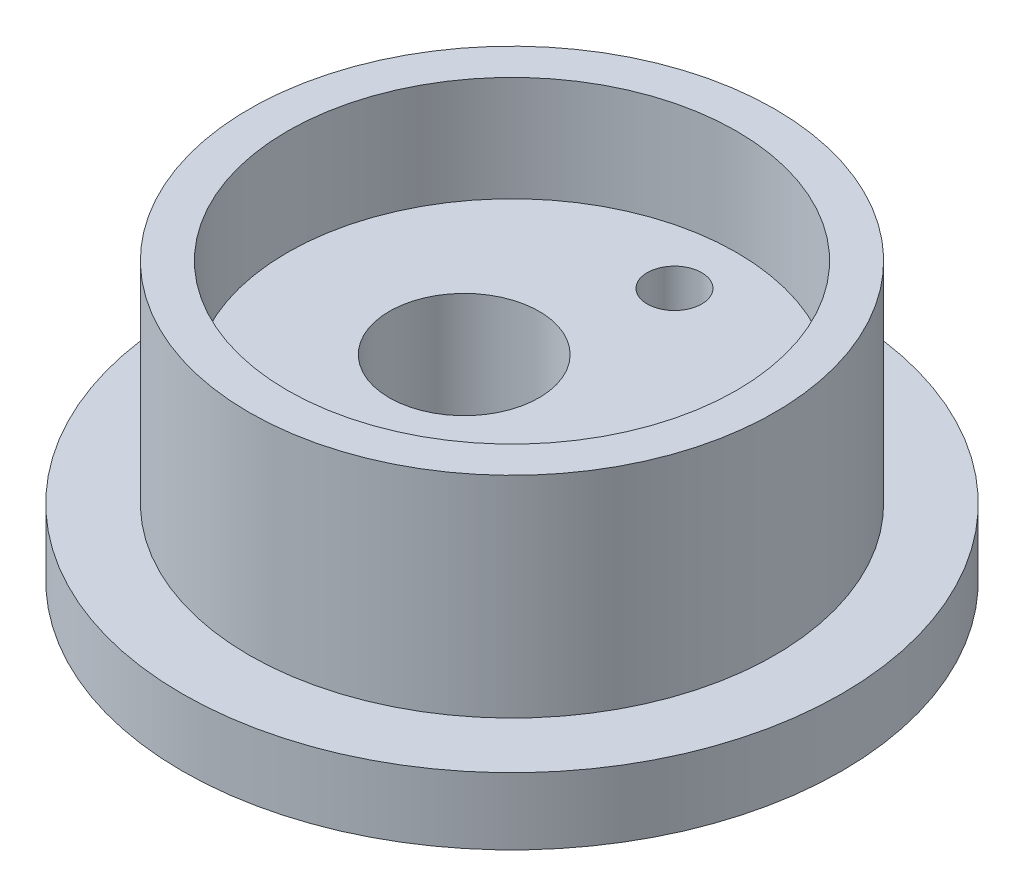
ISO-10303-21;
HEADER;
FILE_DESCRIPTION(('STEP AP214'),'2;1');
FILE_NAME('part.step','',(''),(''),'','','');
FILE_SCHEMA(('AUTOMOTIVE_DESIGN { 1 0 10303 214 1 1 1 1 }'));
ENDSEC;
DATA;
#1=APPLICATION_CONTEXT('core data for automotive mechanical design processes');
#2=APPLICATION_PROTOCOL_DEFINITION('international standard','automotive_design',2000,#1);
#3=PRODUCT_CONTEXT('',#1,'mechanical');
#4=PRODUCT('Part','Part','',(#3));
#5=PRODUCT_RELATED_PRODUCT_CATEGORY('part','',(#4));
#6=PRODUCT_DEFINITION_FORMATION('','',#4);
#7=PRODUCT_DEFINITION_CONTEXT('part definition',#1,'design');
#8=PRODUCT_DEFINITION('design','',#6,#7);
#9=PRODUCT_DEFINITION_SHAPE('','',#8);
#10=(LENGTH_UNIT() NAMED_UNIT(*) SI_UNIT(.MILLI.,.METRE.));
#11=(NAMED_UNIT(*) PLANE_ANGLE_UNIT() SI_UNIT($,.RADIAN.));
#12=(NAMED_UNIT(*) SI_UNIT($,.STERADIAN.) SOLID_ANGLE_UNIT());
#13=UNCERTAINTY_MEASURE_WITH_UNIT(LENGTH_MEASURE(1.E-05),#10,'distance_accuracy_value','');
#14=(GEOMETRIC_REPRESENTATION_CONTEXT(3) GLOBAL_UNCERTAINTY_ASSIGNED_CONTEXT((#13)) GLOBAL_UNIT_ASSIGNED_CONTEXT((#10,
#11,#12)) REPRESENTATION_CONTEXT('',''));
#15=CARTESIAN_POINT('',(0.,0.,0.));
#16=DIRECTION('',(0.,0.,1.));
#17=DIRECTION('',(1.,0.,0.));
#18=AXIS2_PLACEMENT_3D('',#15,#16,#17);
#19=CARTESIAN_POINT('',(0.,0.,0.));
#20=DIRECTION('',(0.,-1.,0.));
#21=DIRECTION('',(0.,0.,-1.));
#22=AXIS2_PLACEMENT_3D('',#19,#20,#21);
#23=PLANE('',#22);
#24=CARTESIAN_POINT('',(0.,0.,431.8));
#25=DIRECTION('',(0.,1.,0.));
#26=DIRECTION('',(0.,0.,1.));
#27=AXIS2_PLACEMENT_3D('',#24,#25,#26);
#28=CIRCLE('',#27,72.39);
#29=CARTESIAN_POINT('',(0.,0.,504.19));
#30=VERTEX_POINT('',#29);
#31=EDGE_CURVE('E68',#30,#30,#28,.T.);
#32=ORIENTED_EDGE('',*,*,#31,.T.);
#33=EDGE_LOOP('',(#32));
#34=FACE_BOUND('',#33,.T.);
#35=CARTESIAN_POINT('',(431.8,0.,0.));
#36=DIRECTION('',(0.,1.,0.));
#37=DIRECTION('',(0.,0.,1.));
#38=AXIS2_PLACEMENT_3D('',#35,#36,#37);
#39=CIRCLE('',#38,72.39);
#40=CARTESIAN_POINT('',(431.8,0.,72.39));
#41=VERTEX_POINT('',#40);
#42=EDGE_CURVE('E74',#41,#41,#39,.T.);
#43=ORIENTED_EDGE('',*,*,#42,.T.);
#44=EDGE_LOOP('',(#43));
#45=FACE_BOUND('',#44,.T.);
#46=CARTESIAN_POINT('',(0.,0.,-431.8));
#47=DIRECTION('',(0.,1.,0.));
#48=DIRECTION('',(0.,0.,1.));
#49=AXIS2_PLACEMENT_3D('',#46,#47,#48);
#50=CIRCLE('',#49,72.39);
#51=CARTESIAN_POINT('',(0.,0.,-359.41));
#52=VERTEX_POINT('',#51);
#53=EDGE_CURVE('E80',#52,#52,#50,.T.);
#54=ORIENTED_EDGE('',*,*,#53,.T.);
#55=EDGE_LOOP('',(#54));
#56=FACE_BOUND('',#55,.T.);
#57=CARTESIAN_POINT('',(-127.,0.,0.));
#58=DIRECTION('',(0.,1.,0.));
#59=DIRECTION('',(0.,0.,1.));
#60=AXIS2_PLACEMENT_3D('',#57,#58,#59);
#61=CIRCLE('',#60,199.136);
#62=CARTESIAN_POINT('',(-127.,0.,199.136));
#63=VERTEX_POINT('',#62);
#64=EDGE_CURVE('E61',#63,#63,#61,.T.);
#65=ORIENTED_EDGE('',*,*,#64,.T.);
#66=EDGE_LOOP('',(#65));
#67=FACE_BOUND('',#66,.T.);
#68=CARTESIAN_POINT('',(0.,0.,0.));
#69=DIRECTION('',(0.,-1.,0.));
#70=DIRECTION('',(0.,0.,-1.));
#71=AXIS2_PLACEMENT_3D('',#68,#69,#70);
#72=CIRCLE('',#71,876.3);
#73=CARTESIAN_POINT('',(0.,0.,-876.3));
#74=VERTEX_POINT('',#73);
#75=EDGE_CURVE('E10',#74,#74,#72,.T.);
#76=ORIENTED_EDGE('',*,*,#75,.T.);
#77=EDGE_LOOP('',(#76));
#78=FACE_BOUND('',#77,.T.);
#79=ADVANCED_FACE('F36',(#34,#45,#56,#67,#78),#23,.T.);
#80=CARTESIAN_POINT('',(0.,-147.18331233267,0.));
#81=DIRECTION('',(0.,-1.,0.));
#82=DIRECTION('',(0.,0.,-1.));
#83=AXIS2_PLACEMENT_3D('',#80,#81,#82);
#84=CYLINDRICAL_SURFACE('',#83,876.3);
#85=CARTESIAN_POINT('',(0.,177.8,0.));
#86=DIRECTION('',(0.,-1.,0.));
#87=DIRECTION('',(0.,0.,-1.));
#88=AXIS2_PLACEMENT_3D('',#85,#86,#87);
#89=CIRCLE('',#88,876.3);
#90=CARTESIAN_POINT('',(0.,177.8,-876.3));
#91=VERTEX_POINT('',#90);
#92=EDGE_CURVE('E42',#91,#91,#89,.T.);
#93=ORIENTED_EDGE('',*,*,#92,.T.);
#94=EDGE_LOOP('',(#93));
#95=FACE_BOUND('',#94,.T.);
#96=ORIENTED_EDGE('',*,*,#75,.F.);
#97=EDGE_LOOP('',(#96));
#98=FACE_BOUND('',#97,.T.);
#99=ADVANCED_FACE('F116',(#95,#98),#84,.T.);
#100=CARTESIAN_POINT('',(876.3,177.8,0.));
#101=DIRECTION('',(0.,1.,0.));
#102=DIRECTION('',(0.,0.,1.));
#103=AXIS2_PLACEMENT_3D('',#100,#101,#102);
#104=PLANE('',#103);
#105=CARTESIAN_POINT('',(0.,177.8,0.));
#106=DIRECTION('',(0.,-1.,0.));
#107=DIRECTION('',(0.,0.,-1.));
#108=AXIS2_PLACEMENT_3D('',#105,#106,#107);
#109=CIRCLE('',#108,698.5);
#110=CARTESIAN_POINT('',(0.,177.8,-698.5));
#111=VERTEX_POINT('',#110);
#112=EDGE_CURVE('E46',#111,#111,#109,.T.);
#113=ORIENTED_EDGE('',*,*,#112,.T.);
#114=EDGE_LOOP('',(#113));
#115=FACE_BOUND('',#114,.T.);
#116=ORIENTED_EDGE('',*,*,#92,.F.);
#117=EDGE_LOOP('',(#116));
#118=FACE_BOUND('',#117,.T.);
#119=ADVANCED_FACE('F110',(#115,#118),#104,.T.);
#120=CARTESIAN_POINT('',(0.,-147.18331233267,0.));
#121=DIRECTION('',(0.,-1.,0.));
#122=DIRECTION('',(0.,0.,-1.));
#123=AXIS2_PLACEMENT_3D('',#120,#121,#122);
#124=CYLINDRICAL_SURFACE('',#123,698.5);
#125=CARTESIAN_POINT('',(0.,736.6,0.));
#126=DIRECTION('',(0.,-1.,0.));
#127=DIRECTION('',(0.,0.,-1.));
#128=AXIS2_PLACEMENT_3D('',#125,#126,#127);
#129=CIRCLE('',#128,698.5);
#130=CARTESIAN_POINT('',(0.,736.6,-698.5));
#131=VERTEX_POINT('',#130);
#132=EDGE_CURVE('E50',#131,#131,#129,.T.);
#133=ORIENTED_EDGE('',*,*,#132,.T.);
#134=EDGE_LOOP('',(#133));
#135=FACE_BOUND('',#134,.T.);
#136=ORIENTED_EDGE('',*,*,#112,.F.);
#137=EDGE_LOOP('',(#136));
#138=FACE_BOUND('',#137,.T.);
#139=ADVANCED_FACE('F104',(#135,#138),#124,.T.);
#140=CARTESIAN_POINT('',(698.5,736.6,0.));
#141=DIRECTION('',(0.,1.,0.));
#142=DIRECTION('',(0.,0.,1.));
#143=AXIS2_PLACEMENT_3D('',#140,#141,#142);
#144=PLANE('',#143);
#145=CARTESIAN_POINT('',(0.,736.6,0.));
#146=DIRECTION('',(0.,-1.,0.));
#147=DIRECTION('',(0.,0.,-1.));
#148=AXIS2_PLACEMENT_3D('',#145,#146,#147);
#149=CIRCLE('',#148,596.9);
#150=CARTESIAN_POINT('',(0.,736.6,-596.9));
#151=VERTEX_POINT('',#150);
#152=EDGE_CURVE('E55',#151,#151,#149,.T.);
#153=ORIENTED_EDGE('',*,*,#152,.T.);
#154=EDGE_LOOP('',(#153));
#155=FACE_BOUND('',#154,.T.);
#156=ORIENTED_EDGE('',*,*,#132,.F.);
#157=EDGE_LOOP('',(#156));
#158=FACE_BOUND('',#157,.T.);
#159=ADVANCED_FACE('F98',(#155,#158),#144,.T.);
#160=CARTESIAN_POINT('',(0.,-147.18331233267,0.));
#161=DIRECTION('',(0.,-1.,0.));
#162=DIRECTION('',(0.,0.,-1.));
#163=AXIS2_PLACEMENT_3D('',#160,#161,#162);
#164=CYLINDRICAL_SURFACE('',#163,596.9);
#165=CARTESIAN_POINT('',(0.,457.2,0.));
#166=DIRECTION('',(0.,-1.,0.));
#167=DIRECTION('',(0.,0.,-1.));
#168=AXIS2_PLACEMENT_3D('',#165,#166,#167);
#169=CIRCLE('',#168,596.9);
#170=CARTESIAN_POINT('',(0.,457.2,-596.9));
#171=VERTEX_POINT('',#170);
#172=EDGE_CURVE('E58',#171,#171,#169,.T.);
#173=ORIENTED_EDGE('',*,*,#172,.T.);
#174=EDGE_LOOP('',(#173));
#175=FACE_BOUND('',#174,.T.);
#176=ORIENTED_EDGE('',*,*,#152,.F.);
#177=EDGE_LOOP('',(#176));
#178=FACE_BOUND('',#177,.T.);
#179=ADVANCED_FACE('F91',(#175,#178),#164,.F.);
#180=CARTESIAN_POINT('',(596.9,457.2,0.));
#181=DIRECTION('',(0.,1.,0.));
#182=DIRECTION('',(0.,0.,1.));
#183=AXIS2_PLACEMENT_3D('',#180,#181,#182);
#184=PLANE('',#183);
#185=CARTESIAN_POINT('',(-127.,457.2,0.));
#186=DIRECTION('',(0.,1.,0.));
#187=DIRECTION('',(0.,0.,1.));
#188=AXIS2_PLACEMENT_3D('',#185,#186,#187);
#189=CIRCLE('',#188,199.136);
#190=CARTESIAN_POINT('',(-127.,457.2,199.136));
#191=VERTEX_POINT('',#190);
#192=EDGE_CURVE('E62',#191,#191,#189,.T.);
#193=ORIENTED_EDGE('',*,*,#192,.F.);
#194=EDGE_LOOP('',(#193));
#195=FACE_BOUND('',#194,.T.);
#196=CARTESIAN_POINT('',(0.,457.2,431.8));
#197=DIRECTION('',(0.,1.,0.));
#198=DIRECTION('',(0.,0.,1.));
#199=AXIS2_PLACEMENT_3D('',#196,#197,#198);
#200=CIRCLE('',#199,72.39);
#201=CARTESIAN_POINT('',(0.,457.2,504.19));
#202=VERTEX_POINT('',#201);
#203=EDGE_CURVE('E71',#202,#202,#200,.T.);
#204=ORIENTED_EDGE('',*,*,#203,.F.);
#205=EDGE_LOOP('',(#204));
#206=FACE_BOUND('',#205,.T.);
#207=CARTESIAN_POINT('',(431.8,457.2,0.));
#208=DIRECTION('',(0.,1.,0.));
#209=DIRECTION('',(0.,0.,1.));
#210=AXIS2_PLACEMENT_3D('',#207,#208,#209);
#211=CIRCLE('',#210,72.39);
#212=CARTESIAN_POINT('',(431.8,457.2,72.39));
#213=VERTEX_POINT('',#212);
#214=EDGE_CURVE('E77',#213,#213,#211,.T.);
#215=ORIENTED_EDGE('',*,*,#214,.F.);
#216=EDGE_LOOP('',(#215));
#217=FACE_BOUND('',#216,.T.);
#218=CARTESIAN_POINT('',(0.,457.2,-431.8));
#219=DIRECTION('',(0.,1.,0.));
#220=DIRECTION('',(0.,0.,1.));
#221=AXIS2_PLACEMENT_3D('',#218,#219,#220);
#222=CIRCLE('',#221,72.39);
#223=CARTESIAN_POINT('',(0.,457.2,-359.41));
#224=VERTEX_POINT('',#223);
#225=EDGE_CURVE('E65',#224,#224,#222,.T.);
#226=ORIENTED_EDGE('',*,*,#225,.F.);
#227=EDGE_LOOP('',(#226));
#228=FACE_BOUND('',#227,.T.);
#229=ORIENTED_EDGE('',*,*,#172,.F.);
#230=EDGE_LOOP('',(#229));
#231=FACE_BOUND('',#230,.T.);
#232=ADVANCED_FACE('F88',(#195,#206,#217,#228,#231),#184,.T.);
#233=CARTESIAN_POINT('',(0.,0.,-431.8));
#234=DIRECTION('',(0.,1.,0.));
#235=DIRECTION('',(0.,0.,1.));
#236=AXIS2_PLACEMENT_3D('',#233,#234,#235);
#237=CYLINDRICAL_SURFACE('',#236,72.39);
#238=ORIENTED_EDGE('',*,*,#53,.F.);
#239=EDGE_LOOP('',(#238));
#240=FACE_BOUND('',#239,.T.);
#241=ORIENTED_EDGE('',*,*,#225,.T.);
#242=EDGE_LOOP('',(#241));
#243=FACE_BOUND('',#242,.T.);
#244=ADVANCED_FACE('F86',(#240,#243),#237,.F.);
#245=CARTESIAN_POINT('',(431.8,0.,0.));
#246=DIRECTION('',(0.,1.,0.));
#247=DIRECTION('',(0.,0.,1.));
#248=AXIS2_PLACEMENT_3D('',#245,#246,#247);
#249=CYLINDRICAL_SURFACE('',#248,72.39);
#250=ORIENTED_EDGE('',*,*,#42,.F.);
#251=EDGE_LOOP('',(#250));
#252=FACE_BOUND('',#251,.T.);
#253=ORIENTED_EDGE('',*,*,#214,.T.);
#254=EDGE_LOOP('',(#253));
#255=FACE_BOUND('',#254,.T.);
#256=ADVANCED_FACE('F144',(#252,#255),#249,.F.);
#257=CARTESIAN_POINT('',(0.,0.,431.8));
#258=DIRECTION('',(0.,1.,0.));
#259=DIRECTION('',(0.,0.,1.));
#260=AXIS2_PLACEMENT_3D('',#257,#258,#259);
#261=CYLINDRICAL_SURFACE('',#260,72.39);
#262=ORIENTED_EDGE('',*,*,#31,.F.);
#263=EDGE_LOOP('',(#262));
#264=FACE_BOUND('',#263,.T.);
#265=ORIENTED_EDGE('',*,*,#203,.T.);
#266=EDGE_LOOP('',(#265));
#267=FACE_BOUND('',#266,.T.);
#268=ADVANCED_FACE('F136',(#264,#267),#261,.F.);
#269=CARTESIAN_POINT('',(-127.,0.,0.));
#270=DIRECTION('',(0.,1.,0.));
#271=DIRECTION('',(0.,0.,1.));
#272=AXIS2_PLACEMENT_3D('',#269,#270,#271);
#273=CYLINDRICAL_SURFACE('',#272,199.136);
#274=ORIENTED_EDGE('',*,*,#64,.F.);
#275=EDGE_LOOP('',(#274));
#276=FACE_BOUND('',#275,.T.);
#277=ORIENTED_EDGE('',*,*,#192,.T.);
#278=EDGE_LOOP('',(#277));
#279=FACE_BOUND('',#278,.T.);
#280=ADVANCED_FACE('F133',(#276,#279),#273,.F.);
#281=CLOSED_SHELL('',(#79,#99,#119,#139,#159,#179,#232,#244,#256,#268,#280));
#282=MANIFOLD_SOLID_BREP('B2',#281);
#283=ADVANCED_BREP_SHAPE_REPRESENTATION('',(#18,#282),#14);
#284=SHAPE_DEFINITION_REPRESENTATION(#9,#283);
ENDSEC;
END-ISO-10303-21;
